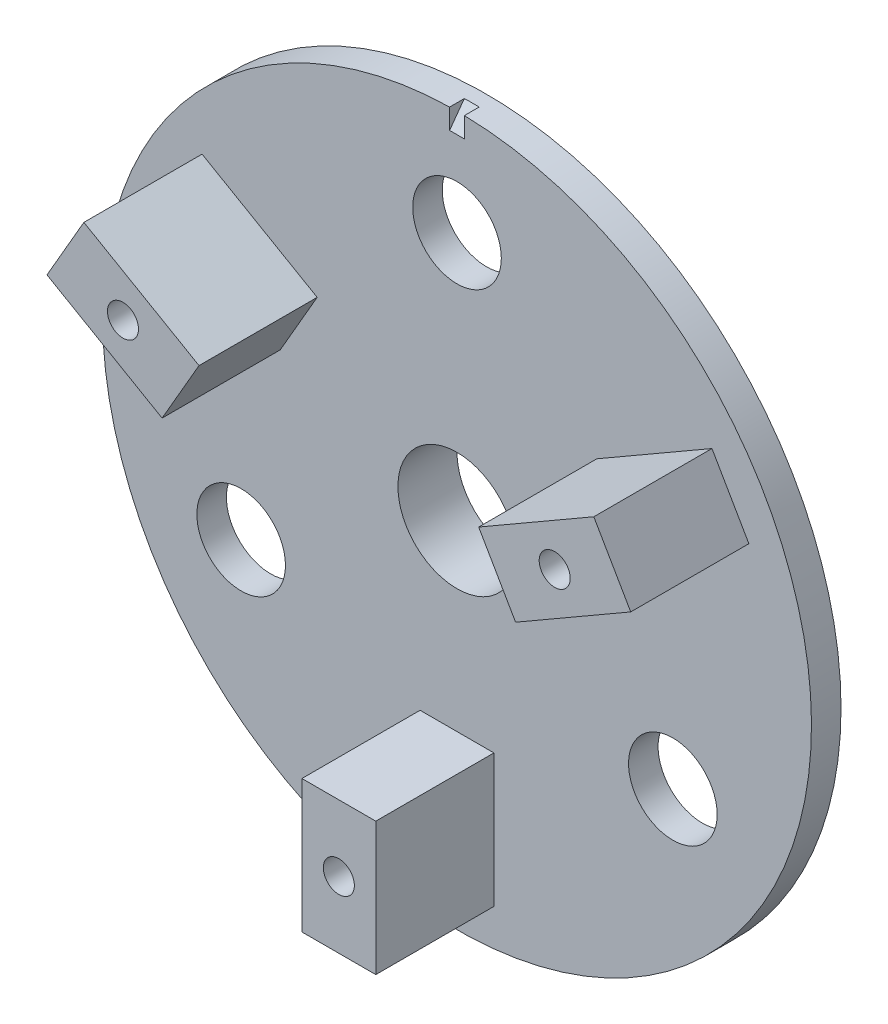
ISO-10303-21;
HEADER;
FILE_DESCRIPTION(('STEP AP214'),'2;1');
FILE_NAME('part.step','',(''),(''),'','','');
FILE_SCHEMA(('AUTOMOTIVE_DESIGN { 1 0 10303 214 1 1 1 1 }'));
ENDSEC;
DATA;
#1=APPLICATION_CONTEXT('core data for automotive mechanical design processes');
#2=APPLICATION_PROTOCOL_DEFINITION('international standard','automotive_design',2000,#1);
#3=PRODUCT_CONTEXT('',#1,'mechanical');
#4=PRODUCT('Part','Part','',(#3));
#5=PRODUCT_RELATED_PRODUCT_CATEGORY('part','',(#4));
#6=PRODUCT_DEFINITION_FORMATION('','',#4);
#7=PRODUCT_DEFINITION_CONTEXT('part definition',#1,'design');
#8=PRODUCT_DEFINITION('design','',#6,#7);
#9=PRODUCT_DEFINITION_SHAPE('','',#8);
#10=(LENGTH_UNIT() NAMED_UNIT(*) SI_UNIT(.MILLI.,.METRE.));
#11=(NAMED_UNIT(*) PLANE_ANGLE_UNIT() SI_UNIT($,.RADIAN.));
#12=(NAMED_UNIT(*) SI_UNIT($,.STERADIAN.) SOLID_ANGLE_UNIT());
#13=UNCERTAINTY_MEASURE_WITH_UNIT(LENGTH_MEASURE(1.E-05),#10,'distance_accuracy_value','');
#14=(GEOMETRIC_REPRESENTATION_CONTEXT(3) GLOBAL_UNCERTAINTY_ASSIGNED_CONTEXT((#13)) GLOBAL_UNIT_ASSIGNED_CONTEXT((#10,
#11,#12)) REPRESENTATION_CONTEXT('',''));
#15=CARTESIAN_POINT('',(0.,0.,0.));
#16=DIRECTION('',(0.,0.,1.));
#17=DIRECTION('',(1.,0.,0.));
#18=AXIS2_PLACEMENT_3D('',#15,#16,#17);
#19=CARTESIAN_POINT('',(0.,0.,2.));
#20=DIRECTION('',(0.,0.,1.));
#21=DIRECTION('',(1.,0.,0.));
#22=AXIS2_PLACEMENT_3D('',#19,#20,#21);
#23=PLANE('',#22);
#24=CARTESIAN_POINT('',(-29.2283573777247,-16.8750000000001,2.));
#25=DIRECTION('',(0.,0.,1.));
#26=DIRECTION('',(1.,0.,0.));
#27=AXIS2_PLACEMENT_3D('',#24,#25,#26);
#28=CIRCLE('',#27,6.);
#29=CARTESIAN_POINT('',(-23.2283573777247,-16.8750000000001,2.));
#30=VERTEX_POINT('',#29);
#31=EDGE_CURVE('E285',#30,#30,#28,.T.);
#32=ORIENTED_EDGE('',*,*,#31,.F.);
#33=EDGE_LOOP('',(#32));
#34=FACE_BOUND('',#33,.T.);
#35=CARTESIAN_POINT('',(29.228357377725,-16.8749999999997,2.));
#36=DIRECTION('',(0.,0.,1.));
#37=DIRECTION('',(1.,0.,0.));
#38=AXIS2_PLACEMENT_3D('',#35,#36,#37);
#39=CIRCLE('',#38,6.);
#40=CARTESIAN_POINT('',(35.228357377725,-16.8749999999997,2.));
#41=VERTEX_POINT('',#40);
#42=EDGE_CURVE('E278',#41,#41,#39,.T.);
#43=ORIENTED_EDGE('',*,*,#42,.F.);
#44=EDGE_LOOP('',(#43));
#45=FACE_BOUND('',#44,.T.);
#46=CARTESIAN_POINT('',(0.,33.75,2.000012));
#47=DIRECTION('',(0.,0.,1.));
#48=DIRECTION('',(1.,0.,0.));
#49=AXIS2_PLACEMENT_3D('',#46,#47,#48);
#50=CIRCLE('',#49,6.);
#51=CARTESIAN_POINT('',(6.00000000000001,33.75,2.000012));
#52=VERTEX_POINT('',#51);
#53=EDGE_CURVE('E287',#52,#52,#50,.T.);
#54=ORIENTED_EDGE('',*,*,#53,.F.);
#55=EDGE_LOOP('',(#54));
#56=FACE_BOUND('',#55,.T.);
#57=CARTESIAN_POINT('',(0.,0.,2.));
#58=DIRECTION('',(0.,0.,1.));
#59=DIRECTION('',(1.,0.,0.));
#60=AXIS2_PLACEMENT_3D('',#57,#58,#59);
#61=CIRCLE('',#60,8.);
#62=CARTESIAN_POINT('',(8.,0.,2.));
#63=VERTEX_POINT('',#62);
#64=EDGE_CURVE('E292',#63,#63,#61,.T.);
#65=ORIENTED_EDGE('',*,*,#64,.F.);
#66=EDGE_LOOP('',(#65));
#67=FACE_BOUND('',#66,.T.);
#68=CARTESIAN_POINT('',(0.,0.,2.));
#69=DIRECTION('',(0.,0.,1.));
#70=DIRECTION('',(1.,0.,0.));
#71=AXIS2_PLACEMENT_3D('',#68,#69,#70);
#72=CIRCLE('',#71,48.);
#73=CARTESIAN_POINT('',(-1.,47.9895822028073,2.));
#74=VERTEX_POINT('',#73);
#75=CARTESIAN_POINT('',(1.,47.9895822028073,2.));
#76=VERTEX_POINT('',#75);
#77=EDGE_CURVE('E336',#74,#76,#72,.T.);
#78=ORIENTED_EDGE('',*,*,#77,.T.);
#79=DIRECTION('',(0.,-1.,0.));
#80=VECTOR('',#79,1.);
#81=CARTESIAN_POINT('',(0.999999999999998,48.,2.));
#82=LINE('',#81,#80);
#83=CARTESIAN_POINT('',(1.,45.2477456734983,2.));
#84=VERTEX_POINT('',#83);
#85=EDGE_CURVE('E254',#76,#84,#82,.T.);
#86=ORIENTED_EDGE('',*,*,#85,.T.);
#87=DIRECTION('',(1.,0.,0.));
#88=VECTOR('',#87,1.);
#89=CARTESIAN_POINT('',(-1.,45.2477456734983,2.));
#90=LINE('',#89,#88);
#91=CARTESIAN_POINT('',(-1.,45.2477456734983,2.));
#92=VERTEX_POINT('',#91);
#93=EDGE_CURVE('E261',#92,#84,#90,.T.);
#94=ORIENTED_EDGE('',*,*,#93,.F.);
#95=DIRECTION('',(0.,-1.,0.));
#96=VECTOR('',#95,1.);
#97=CARTESIAN_POINT('',(-1.,48.,2.));
#98=LINE('',#97,#96);
#99=EDGE_CURVE('E251',#74,#92,#98,.T.);
#100=ORIENTED_EDGE('',*,*,#99,.F.);
#101=EDGE_LOOP('',(#78,#86,#94,#100));
#102=FACE_BOUND('',#101,.T.);
#103=DIRECTION('',(-1.,0.,0.));
#104=VECTOR('',#103,1.);
#105=CARTESIAN_POINT('',(0.,-42.75,2.));
#106=LINE('',#105,#104);
#107=CARTESIAN_POINT('',(5.,-42.75,2.));
#108=VERTEX_POINT('',#107);
#109=CARTESIAN_POINT('',(-5.,-42.75,2.));
#110=VERTEX_POINT('',#109);
#111=EDGE_CURVE('E356',#108,#110,#106,.T.);
#112=ORIENTED_EDGE('',*,*,#111,.T.);
#113=DIRECTION('',(0.,1.,0.));
#114=VECTOR('',#113,1.);
#115=CARTESIAN_POINT('',(-5.,0.,2.));
#116=LINE('',#115,#114);
#117=CARTESIAN_POINT('',(-5.,-24.75,2.));
#118=VERTEX_POINT('',#117);
#119=EDGE_CURVE('E365',#110,#118,#116,.T.);
#120=ORIENTED_EDGE('',*,*,#119,.T.);
#121=DIRECTION('',(1.,0.,0.));
#122=VECTOR('',#121,1.);
#123=CARTESIAN_POINT('',(0.,-24.75,2.));
#124=LINE('',#123,#122);
#125=CARTESIAN_POINT('',(5.,-24.75,2.));
#126=VERTEX_POINT('',#125);
#127=EDGE_CURVE('E347',#118,#126,#124,.T.);
#128=ORIENTED_EDGE('',*,*,#127,.T.);
#129=DIRECTION('',(0.,-1.,0.));
#130=VECTOR('',#129,1.);
#131=CARTESIAN_POINT('',(5.,0.,2.));
#132=LINE('',#131,#130);
#133=EDGE_CURVE('E353',#126,#108,#132,.T.);
#134=ORIENTED_EDGE('',*,*,#133,.T.);
#135=EDGE_LOOP('',(#112,#120,#128,#134));
#136=FACE_BOUND('',#135,.T.);
#137=DIRECTION('',(0.500000000000001,0.866025403784439,0.));
#138=VECTOR('',#137,1.);
#139=CARTESIAN_POINT('',(-37.0225860117848,21.375,2.));
#140=LINE('',#139,#138);
#141=CARTESIAN_POINT('',(-39.5225860117848,17.0448729810778,2.));
#142=VERTEX_POINT('',#141);
#143=CARTESIAN_POINT('',(-34.5225860117848,25.7051270189222,2.));
#144=VERTEX_POINT('',#143);
#145=EDGE_CURVE('E372',#142,#144,#140,.T.);
#146=ORIENTED_EDGE('',*,*,#145,.T.);
#147=DIRECTION('',(0.866025403784439,-0.500000000000001,0.));
#148=VECTOR('',#147,1.);
#149=CARTESIAN_POINT('',(2.5,4.33012701892219,2.));
#150=LINE('',#149,#148);
#151=CARTESIAN_POINT('',(-18.9341287436649,16.7051270189222,2.));
#152=VERTEX_POINT('',#151);
#153=EDGE_CURVE('E377',#144,#152,#150,.T.);
#154=ORIENTED_EDGE('',*,*,#153,.T.);
#155=DIRECTION('',(-0.500000000000001,-0.866025403784439,0.));
#156=VECTOR('',#155,1.);
#157=CARTESIAN_POINT('',(-21.4341287436649,12.375,2.));
#158=LINE('',#157,#156);
#159=CARTESIAN_POINT('',(-23.9341287436649,8.04487298107782,2.));
#160=VERTEX_POINT('',#159);
#161=EDGE_CURVE('E366',#152,#160,#158,.T.);
#162=ORIENTED_EDGE('',*,*,#161,.T.);
#163=DIRECTION('',(-0.866025403784439,0.500000000000001,0.));
#164=VECTOR('',#163,1.);
#165=CARTESIAN_POINT('',(-2.5,-4.3301270189222,2.));
#166=LINE('',#165,#164);
#167=EDGE_CURVE('E369',#160,#142,#166,.T.);
#168=ORIENTED_EDGE('',*,*,#167,.T.);
#169=EDGE_LOOP('',(#146,#154,#162,#168));
#170=FACE_BOUND('',#169,.T.);
#171=DIRECTION('',(0.5,-0.866025403784439,0.));
#172=VECTOR('',#171,1.);
#173=CARTESIAN_POINT('',(37.0225860117848,21.375,2.));
#174=LINE('',#173,#172);
#175=CARTESIAN_POINT('',(34.5225860117848,25.7051270189222,2.));
#176=VERTEX_POINT('',#175);
#177=CARTESIAN_POINT('',(39.5225860117848,17.0448729810778,2.));
#178=VERTEX_POINT('',#177);
#179=EDGE_CURVE('E49',#176,#178,#174,.T.);
#180=ORIENTED_EDGE('',*,*,#179,.T.);
#181=DIRECTION('',(-0.866025403784439,-0.5,0.));
#182=VECTOR('',#181,1.);
#183=CARTESIAN_POINT('',(2.5,-4.33012701892219,2.));
#184=LINE('',#183,#182);
#185=CARTESIAN_POINT('',(23.9341287436649,8.0448729810778,2.));
#186=VERTEX_POINT('',#185);
#187=EDGE_CURVE('E11',#178,#186,#184,.T.);
#188=ORIENTED_EDGE('',*,*,#187,.T.);
#189=DIRECTION('',(-0.5,0.866025403784439,0.));
#190=VECTOR('',#189,1.);
#191=CARTESIAN_POINT('',(21.4341287436649,12.375,2.));
#192=LINE('',#191,#190);
#193=CARTESIAN_POINT('',(18.9341287436649,16.7051270189222,2.));
#194=VERTEX_POINT('',#193);
#195=EDGE_CURVE('E385',#186,#194,#192,.T.);
#196=ORIENTED_EDGE('',*,*,#195,.T.);
#197=DIRECTION('',(0.866025403784439,0.5,0.));
#198=VECTOR('',#197,1.);
#199=CARTESIAN_POINT('',(-2.5,4.33012701892219,2.));
#200=LINE('',#199,#198);
#201=EDGE_CURVE('E388',#194,#176,#200,.T.);
#202=ORIENTED_EDGE('',*,*,#201,.T.);
#203=EDGE_LOOP('',(#180,#188,#196,#202));
#204=FACE_BOUND('',#203,.T.);
#205=ADVANCED_FACE('F41',(#34,#45,#56,#67,#102,#136,#170,#204),#23,.T.);
#206=CARTESIAN_POINT('',(0.,0.,-2.));
#207=DIRECTION('',(0.,0.,1.));
#208=DIRECTION('',(1.,0.,0.));
#209=AXIS2_PLACEMENT_3D('',#206,#207,#208);
#210=PLANE('',#209);
#211=CARTESIAN_POINT('',(0.,0.,-2.));
#212=DIRECTION('',(0.,0.,1.));
#213=DIRECTION('',(1.,0.,0.));
#214=AXIS2_PLACEMENT_3D('',#211,#212,#213);
#215=CIRCLE('',#214,13.);
#216=CARTESIAN_POINT('',(13.,0.,-2.));
#217=VERTEX_POINT('',#216);
#218=EDGE_CURVE('E349',#217,#217,#215,.F.);
#219=ORIENTED_EDGE('',*,*,#218,.F.);
#220=EDGE_LOOP('',(#219));
#221=FACE_BOUND('',#220,.T.);
#222=CARTESIAN_POINT('',(-29.2283573777247,-16.8750000000001,-2.));
#223=DIRECTION('',(0.,0.,1.));
#224=DIRECTION('',(-0.500000000000004,0.866025403784437,0.));
#225=AXIS2_PLACEMENT_3D('',#222,#223,#224);
#226=CIRCLE('',#225,6.);
#227=CARTESIAN_POINT('',(-32.2283573777248,-11.6788475772935,-2.));
#228=VERTEX_POINT('',#227);
#229=EDGE_CURVE('E275',#228,#228,#226,.T.);
#230=ORIENTED_EDGE('',*,*,#229,.T.);
#231=EDGE_LOOP('',(#230));
#232=FACE_BOUND('',#231,.T.);
#233=CARTESIAN_POINT('',(29.228357377725,-16.8749999999997,-2.));
#234=DIRECTION('',(0.,0.,1.));
#235=DIRECTION('',(-0.499999999999992,-0.866025403784443,0.));
#236=AXIS2_PLACEMENT_3D('',#233,#234,#235);
#237=CIRCLE('',#236,6.);
#238=CARTESIAN_POINT('',(26.228357377725,-22.0711524227064,-2.));
#239=VERTEX_POINT('',#238);
#240=EDGE_CURVE('E272',#239,#239,#237,.T.);
#241=ORIENTED_EDGE('',*,*,#240,.T.);
#242=EDGE_LOOP('',(#241));
#243=FACE_BOUND('',#242,.T.);
#244=CARTESIAN_POINT('',(0.,33.75,-2.));
#245=DIRECTION('',(0.,0.,1.));
#246=DIRECTION('',(1.,0.,0.));
#247=AXIS2_PLACEMENT_3D('',#244,#245,#246);
#248=CIRCLE('',#247,6.);
#249=CARTESIAN_POINT('',(6.00000000000001,33.75,-2.));
#250=VERTEX_POINT('',#249);
#251=EDGE_CURVE('E289',#250,#250,#248,.T.);
#252=ORIENTED_EDGE('',*,*,#251,.T.);
#253=EDGE_LOOP('',(#252));
#254=FACE_BOUND('',#253,.T.);
#255=CARTESIAN_POINT('',(0.,0.,-2.));
#256=DIRECTION('',(0.,0.,1.));
#257=DIRECTION('',(1.,0.,0.));
#258=AXIS2_PLACEMENT_3D('',#255,#256,#257);
#259=CIRCLE('',#258,48.);
#260=CARTESIAN_POINT('',(48.,0.,-2.));
#261=VERTEX_POINT('',#260);
#262=EDGE_CURVE('E515',#261,#261,#259,.T.);
#263=ORIENTED_EDGE('',*,*,#262,.F.);
#264=EDGE_LOOP('',(#263));
#265=FACE_BOUND('',#264,.T.);
#266=ADVANCED_FACE('F323',(#221,#232,#243,#254,#265),#210,.F.);
#267=CARTESIAN_POINT('',(0.,0.,2.));
#268=DIRECTION('',(0.,0.,-1.));
#269=DIRECTION('',(-1.,0.,0.));
#270=AXIS2_PLACEMENT_3D('',#267,#268,#269);
#271=CYLINDRICAL_SURFACE('',#270,48.);
#272=DIRECTION('',(0.,0.,-1.));
#273=VECTOR('',#272,1.);
#274=CARTESIAN_POINT('',(-1.,47.9895822028073,2.));
#275=LINE('',#274,#273);
#276=CARTESIAN_POINT('',(-1.,47.9895822028073,0.00757037392393536));
#277=VERTEX_POINT('',#276);
#278=EDGE_CURVE('E344',#74,#277,#275,.T.);
#279=ORIENTED_EDGE('',*,*,#278,.T.);
#280=CARTESIAN_POINT('',(0.,0.,34.8804974437164));
#281=DIRECTION('',(0.,-0.587856465450031,-0.808965250198423));
#282=DIRECTION('',(0.,0.808965250198423,-0.587856465450031));
#283=AXIS2_PLACEMENT_3D('',#280,#281,#282);
#284=ELLIPSE('',#283,59.3350579499262,48.);
#285=CARTESIAN_POINT('',(1.,47.9895822028073,0.00757037392393536));
#286=VERTEX_POINT('',#285);
#287=EDGE_CURVE('E340',#277,#286,#284,.T.);
#288=ORIENTED_EDGE('',*,*,#287,.T.);
#289=DIRECTION('',(0.,0.,-1.));
#290=VECTOR('',#289,1.);
#291=CARTESIAN_POINT('',(1.,47.9895822028073,2.));
#292=LINE('',#291,#290);
#293=EDGE_CURVE('E328',#76,#286,#292,.T.);
#294=ORIENTED_EDGE('',*,*,#293,.F.);
#295=ORIENTED_EDGE('',*,*,#77,.F.);
#296=EDGE_LOOP('',(#279,#288,#294,#295));
#297=FACE_BOUND('',#296,.T.);
#298=ORIENTED_EDGE('',*,*,#262,.T.);
#299=EDGE_LOOP('',(#298));
#300=FACE_BOUND('',#299,.T.);
#301=ADVANCED_FACE('F43',(#297,#300),#271,.T.);
#302=CARTESIAN_POINT('',(0.,0.,2.));
#303=DIRECTION('',(0.,0.,-1.));
#304=DIRECTION('',(-1.,0.,0.));
#305=AXIS2_PLACEMENT_3D('',#302,#303,#304);
#306=CYLINDRICAL_SURFACE('',#305,8.);
#307=ORIENTED_EDGE('',*,*,#64,.T.);
#308=EDGE_LOOP('',(#307));
#309=FACE_BOUND('',#308,.T.);
#310=CARTESIAN_POINT('',(0.,0.,-6.));
#311=DIRECTION('',(0.,0.,1.));
#312=DIRECTION('',(1.,0.,0.));
#313=AXIS2_PLACEMENT_3D('',#310,#311,#312);
#314=CIRCLE('',#313,8.);
#315=CARTESIAN_POINT('',(8.,0.,-6.));
#316=VERTEX_POINT('',#315);
#317=EDGE_CURVE('E244',#316,#316,#314,.T.);
#318=ORIENTED_EDGE('',*,*,#317,.F.);
#319=EDGE_LOOP('',(#318));
#320=FACE_BOUND('',#319,.T.);
#321=ADVANCED_FACE('F312',(#309,#320),#306,.F.);
#322=CARTESIAN_POINT('',(0.,33.75,-2.));
#323=DIRECTION('',(0.,0.,1.));
#324=DIRECTION('',(1.,0.,0.));
#325=AXIS2_PLACEMENT_3D('',#322,#323,#324);
#326=CYLINDRICAL_SURFACE('',#325,6.);
#327=ORIENTED_EDGE('',*,*,#251,.F.);
#328=EDGE_LOOP('',(#327));
#329=FACE_BOUND('',#328,.T.);
#330=ORIENTED_EDGE('',*,*,#53,.T.);
#331=EDGE_LOOP('',(#330));
#332=FACE_BOUND('',#331,.T.);
#333=ADVANCED_FACE('F305',(#329,#332),#326,.F.);
#334=CARTESIAN_POINT('',(29.228357377725,-16.8749999999997,-2.));
#335=DIRECTION('',(0.,0.,1.));
#336=DIRECTION('',(1.,0.,0.));
#337=AXIS2_PLACEMENT_3D('',#334,#335,#336);
#338=CYLINDRICAL_SURFACE('',#337,6.);
#339=ORIENTED_EDGE('',*,*,#42,.T.);
#340=EDGE_LOOP('',(#339));
#341=FACE_BOUND('',#340,.T.);
#342=ORIENTED_EDGE('',*,*,#240,.F.);
#343=EDGE_LOOP('',(#342));
#344=FACE_BOUND('',#343,.T.);
#345=ADVANCED_FACE('F315',(#341,#344),#338,.F.);
#346=CARTESIAN_POINT('',(-29.2283573777247,-16.8750000000001,-2.));
#347=DIRECTION('',(0.,0.,1.));
#348=DIRECTION('',(1.,0.,0.));
#349=AXIS2_PLACEMENT_3D('',#346,#347,#348);
#350=CYLINDRICAL_SURFACE('',#349,6.);
#351=ORIENTED_EDGE('',*,*,#31,.T.);
#352=EDGE_LOOP('',(#351));
#353=FACE_BOUND('',#352,.T.);
#354=ORIENTED_EDGE('',*,*,#229,.F.);
#355=EDGE_LOOP('',(#354));
#356=FACE_BOUND('',#355,.T.);
#357=ADVANCED_FACE('F489',(#353,#356),#350,.F.);
#358=CARTESIAN_POINT('',(-1.,45.2477456734983,2.));
#359=DIRECTION('',(0.,-0.587856465450031,-0.808965250198423));
#360=DIRECTION('',(0.,0.808965250198423,-0.587856465450031));
#361=AXIS2_PLACEMENT_3D('',#358,#359,#360);
#362=PLANE('',#361);
#363=ORIENTED_EDGE('',*,*,#287,.F.);
#364=DIRECTION('',(0.,0.808965250198423,-0.587856465450031));
#365=VECTOR('',#364,1.);
#366=CARTESIAN_POINT('',(-1.,45.2477456734983,2.));
#367=LINE('',#366,#365);
#368=EDGE_CURVE('E259',#92,#277,#367,.T.);
#369=ORIENTED_EDGE('',*,*,#368,.F.);
#370=ORIENTED_EDGE('',*,*,#93,.T.);
#371=DIRECTION('',(0.,0.808965250198423,-0.587856465450031));
#372=VECTOR('',#371,1.);
#373=CARTESIAN_POINT('',(1.,45.2477456734983,2.));
#374=LINE('',#373,#372);
#375=EDGE_CURVE('E257',#84,#286,#374,.T.);
#376=ORIENTED_EDGE('',*,*,#375,.T.);
#377=EDGE_LOOP('',(#363,#369,#370,#376));
#378=FACE_BOUND('',#377,.T.);
#379=ADVANCED_FACE('F483',(#378),#362,.F.);
#380=CARTESIAN_POINT('',(-1.,0.,0.));
#381=DIRECTION('',(-1.,0.,0.));
#382=DIRECTION('',(0.,0.,1.));
#383=AXIS2_PLACEMENT_3D('',#380,#381,#382);
#384=PLANE('',#383);
#385=ORIENTED_EDGE('',*,*,#99,.T.);
#386=ORIENTED_EDGE('',*,*,#368,.T.);
#387=ORIENTED_EDGE('',*,*,#278,.F.);
#388=EDGE_LOOP('',(#385,#386,#387));
#389=FACE_BOUND('',#388,.T.);
#390=ADVANCED_FACE('F481',(#389),#384,.F.);
#391=CARTESIAN_POINT('',(1.,0.,0.));
#392=DIRECTION('',(-1.,0.,0.));
#393=DIRECTION('',(0.,0.,1.));
#394=AXIS2_PLACEMENT_3D('',#391,#392,#393);
#395=PLANE('',#394);
#396=ORIENTED_EDGE('',*,*,#293,.T.);
#397=ORIENTED_EDGE('',*,*,#375,.F.);
#398=ORIENTED_EDGE('',*,*,#85,.F.);
#399=EDGE_LOOP('',(#396,#397,#398));
#400=FACE_BOUND('',#399,.T.);
#401=ADVANCED_FACE('F478',(#400),#395,.T.);
#402=CARTESIAN_POINT('',(0.,0.,0.));
#403=DIRECTION('',(0.,0.,1.));
#404=DIRECTION('',(1.,0.,0.));
#405=AXIS2_PLACEMENT_3D('',#402,#403,#404);
#406=CYLINDRICAL_SURFACE('',#405,13.);
#407=CARTESIAN_POINT('',(0.,0.,-6.));
#408=DIRECTION('',(0.,0.,1.));
#409=DIRECTION('',(1.,0.,0.));
#410=AXIS2_PLACEMENT_3D('',#407,#408,#409);
#411=CIRCLE('',#410,13.);
#412=CARTESIAN_POINT('',(13.,0.,-6.));
#413=VERTEX_POINT('',#412);
#414=EDGE_CURVE('E248',#413,#413,#411,.T.);
#415=ORIENTED_EDGE('',*,*,#414,.T.);
#416=EDGE_LOOP('',(#415));
#417=FACE_BOUND('',#416,.T.);
#418=ORIENTED_EDGE('',*,*,#218,.T.);
#419=EDGE_LOOP('',(#418));
#420=FACE_BOUND('',#419,.T.);
#421=ADVANCED_FACE('F471',(#417,#420),#406,.T.);
#422=CARTESIAN_POINT('',(0.,13.,-6.));
#423=DIRECTION('',(0.,0.,1.));
#424=DIRECTION('',(1.,0.,0.));
#425=AXIS2_PLACEMENT_3D('',#422,#423,#424);
#426=PLANE('',#425);
#427=ORIENTED_EDGE('',*,*,#414,.F.);
#428=EDGE_LOOP('',(#427));
#429=FACE_BOUND('',#428,.T.);
#430=ORIENTED_EDGE('',*,*,#317,.T.);
#431=EDGE_LOOP('',(#430));
#432=FACE_BOUND('',#431,.T.);
#433=ADVANCED_FACE('F473',(#429,#432),#426,.F.);
#434=CARTESIAN_POINT('',(-5.,-42.75,18.));
#435=DIRECTION('',(1.,0.,0.));
#436=DIRECTION('',(0.,0.,-1.));
#437=AXIS2_PLACEMENT_3D('',#434,#435,#436);
#438=PLANE('',#437);
#439=ORIENTED_EDGE('',*,*,#119,.F.);
#440=DIRECTION('',(0.,0.,-1.));
#441=VECTOR('',#440,1.);
#442=CARTESIAN_POINT('',(-5.,-42.75,18.));
#443=LINE('',#442,#441);
#444=CARTESIAN_POINT('',(-5.,-42.75,18.));
#445=VERTEX_POINT('',#444);
#446=EDGE_CURVE('E241',#445,#110,#443,.T.);
#447=ORIENTED_EDGE('',*,*,#446,.F.);
#448=DIRECTION('',(0.,-1.,0.));
#449=VECTOR('',#448,1.);
#450=CARTESIAN_POINT('',(-5.,-42.75,18.));
#451=LINE('',#450,#449);
#452=CARTESIAN_POINT('',(-5.,-24.75,18.));
#453=VERTEX_POINT('',#452);
#454=EDGE_CURVE('E219',#453,#445,#451,.T.);
#455=ORIENTED_EDGE('',*,*,#454,.F.);
#456=DIRECTION('',(0.,0.,-1.));
#457=VECTOR('',#456,1.);
#458=CARTESIAN_POINT('',(-5.,-24.75,18.));
#459=LINE('',#458,#457);
#460=EDGE_CURVE('E229',#453,#118,#459,.T.);
#461=ORIENTED_EDGE('',*,*,#460,.T.);
#462=EDGE_LOOP('',(#439,#447,#455,#461));
#463=FACE_BOUND('',#462,.T.);
#464=ADVANCED_FACE('F470',(#463),#438,.F.);
#465=CARTESIAN_POINT('',(5.,-42.75,18.));
#466=DIRECTION('',(0.,1.,0.));
#467=DIRECTION('',(0.,0.,1.));
#468=AXIS2_PLACEMENT_3D('',#465,#466,#467);
#469=PLANE('',#468);
#470=ORIENTED_EDGE('',*,*,#111,.F.);
#471=DIRECTION('',(0.,0.,-1.));
#472=VECTOR('',#471,1.);
#473=CARTESIAN_POINT('',(5.,-42.75,18.));
#474=LINE('',#473,#472);
#475=CARTESIAN_POINT('',(5.,-42.75,18.));
#476=VERTEX_POINT('',#475);
#477=EDGE_CURVE('E240',#476,#108,#474,.T.);
#478=ORIENTED_EDGE('',*,*,#477,.F.);
#479=DIRECTION('',(1.,0.,0.));
#480=VECTOR('',#479,1.);
#481=CARTESIAN_POINT('',(5.,-42.75,18.));
#482=LINE('',#481,#480);
#483=EDGE_CURVE('E221',#445,#476,#482,.T.);
#484=ORIENTED_EDGE('',*,*,#483,.F.);
#485=ORIENTED_EDGE('',*,*,#446,.T.);
#486=EDGE_LOOP('',(#470,#478,#484,#485));
#487=FACE_BOUND('',#486,.T.);
#488=ADVANCED_FACE('F464',(#487),#469,.F.);
#489=CARTESIAN_POINT('',(5.,-24.75,18.));
#490=DIRECTION('',(-1.,0.,0.));
#491=DIRECTION('',(0.,0.,1.));
#492=AXIS2_PLACEMENT_3D('',#489,#490,#491);
#493=PLANE('',#492);
#494=ORIENTED_EDGE('',*,*,#133,.F.);
#495=DIRECTION('',(0.,0.,-1.));
#496=VECTOR('',#495,1.);
#497=CARTESIAN_POINT('',(5.,-24.75,18.));
#498=LINE('',#497,#496);
#499=CARTESIAN_POINT('',(5.,-24.75,18.));
#500=VERTEX_POINT('',#499);
#501=EDGE_CURVE('E234',#500,#126,#498,.T.);
#502=ORIENTED_EDGE('',*,*,#501,.F.);
#503=DIRECTION('',(0.,1.,0.));
#504=VECTOR('',#503,1.);
#505=CARTESIAN_POINT('',(5.,-24.75,18.));
#506=LINE('',#505,#504);
#507=EDGE_CURVE('E223',#476,#500,#506,.T.);
#508=ORIENTED_EDGE('',*,*,#507,.F.);
#509=ORIENTED_EDGE('',*,*,#477,.T.);
#510=EDGE_LOOP('',(#494,#502,#508,#509));
#511=FACE_BOUND('',#510,.T.);
#512=ADVANCED_FACE('F458',(#511),#493,.F.);
#513=CARTESIAN_POINT('',(-5.,-24.75,18.));
#514=DIRECTION('',(0.,-1.,0.));
#515=DIRECTION('',(0.,0.,-1.));
#516=AXIS2_PLACEMENT_3D('',#513,#514,#515);
#517=PLANE('',#516);
#518=ORIENTED_EDGE('',*,*,#127,.F.);
#519=ORIENTED_EDGE('',*,*,#460,.F.);
#520=DIRECTION('',(-1.,0.,0.));
#521=VECTOR('',#520,1.);
#522=CARTESIAN_POINT('',(-5.,-24.75,18.));
#523=LINE('',#522,#521);
#524=EDGE_CURVE('E227',#500,#453,#523,.T.);
#525=ORIENTED_EDGE('',*,*,#524,.F.);
#526=ORIENTED_EDGE('',*,*,#501,.T.);
#527=EDGE_LOOP('',(#518,#519,#525,#526));
#528=FACE_BOUND('',#527,.T.);
#529=ADVANCED_FACE('F451',(#528),#517,.F.);
#530=CARTESIAN_POINT('',(0.,0.,18.));
#531=DIRECTION('',(0.,0.,-1.));
#532=DIRECTION('',(-1.,0.,0.));
#533=AXIS2_PLACEMENT_3D('',#530,#531,#532);
#534=PLANE('',#533);
#535=CARTESIAN_POINT('',(0.,-33.75,18.));
#536=DIRECTION('',(0.,0.,1.));
#537=DIRECTION('',(1.,0.,0.));
#538=AXIS2_PLACEMENT_3D('',#535,#536,#537);
#539=CIRCLE('',#538,2.1);
#540=CARTESIAN_POINT('',(2.1,-33.75,18.));
#541=VERTEX_POINT('',#540);
#542=EDGE_CURVE('E176',#541,#541,#539,.T.);
#543=ORIENTED_EDGE('',*,*,#542,.F.);
#544=EDGE_LOOP('',(#543));
#545=FACE_BOUND('',#544,.T.);
#546=ORIENTED_EDGE('',*,*,#454,.T.);
#547=ORIENTED_EDGE('',*,*,#483,.T.);
#548=ORIENTED_EDGE('',*,*,#507,.T.);
#549=ORIENTED_EDGE('',*,*,#524,.T.);
#550=EDGE_LOOP('',(#546,#547,#548,#549));
#551=FACE_BOUND('',#550,.T.);
#552=ADVANCED_FACE('F453',(#545,#551),#534,.F.);
#553=CARTESIAN_POINT('',(0.,-33.75,6.));
#554=DIRECTION('',(0.,0.,1.));
#555=DIRECTION('',(1.,0.,0.));
#556=AXIS2_PLACEMENT_3D('',#553,#554,#555);
#557=CYLINDRICAL_SURFACE('',#556,2.1);
#558=CARTESIAN_POINT('',(0.,-33.75,6.));
#559=DIRECTION('',(0.,0.,1.));
#560=DIRECTION('',(1.,0.,0.));
#561=AXIS2_PLACEMENT_3D('',#558,#559,#560);
#562=CIRCLE('',#561,2.1);
#563=CARTESIAN_POINT('',(2.1,-33.75,6.));
#564=VERTEX_POINT('',#563);
#565=EDGE_CURVE('E185',#564,#564,#562,.T.);
#566=ORIENTED_EDGE('',*,*,#565,.F.);
#567=EDGE_LOOP('',(#566));
#568=FACE_BOUND('',#567,.T.);
#569=ORIENTED_EDGE('',*,*,#542,.T.);
#570=EDGE_LOOP('',(#569));
#571=FACE_BOUND('',#570,.T.);
#572=ADVANCED_FACE('F450',(#568,#571),#557,.F.);
#573=CARTESIAN_POINT('',(0.,-33.75,6.));
#574=DIRECTION('',(0.,0.,1.));
#575=DIRECTION('',(1.,0.,0.));
#576=AXIS2_PLACEMENT_3D('',#573,#574,#575);
#577=PLANE('',#576);
#578=ORIENTED_EDGE('',*,*,#565,.T.);
#579=EDGE_LOOP('',(#578));
#580=FACE_BOUND('',#579,.T.);
#581=ADVANCED_FACE('F442',(#580),#577,.T.);
#582=CARTESIAN_POINT('',(-34.5225860117848,25.7051270189222,18.));
#583=DIRECTION('',(-0.500000000000001,-0.866025403784438,0.));
#584=DIRECTION('',(0.866025403784439,-0.500000000000001,0.));
#585=AXIS2_PLACEMENT_3D('',#582,#583,#584);
#586=PLANE('',#585);
#587=ORIENTED_EDGE('',*,*,#153,.F.);
#588=DIRECTION('',(0.,0.,-1.));
#589=VECTOR('',#588,1.);
#590=CARTESIAN_POINT('',(-34.5225860117848,25.7051270189222,18.));
#591=LINE('',#590,#589);
#592=CARTESIAN_POINT('',(-34.5225860117848,25.7051270189222,18.));
#593=VERTEX_POINT('',#592);
#594=EDGE_CURVE('E175',#593,#144,#591,.T.);
#595=ORIENTED_EDGE('',*,*,#594,.F.);
#596=DIRECTION('',(-0.866025403784439,0.5,0.));
#597=VECTOR('',#596,1.);
#598=CARTESIAN_POINT('',(-34.5225860117848,25.7051270189222,18.));
#599=LINE('',#598,#597);
#600=CARTESIAN_POINT('',(-18.9341287436649,16.7051270189222,18.));
#601=VERTEX_POINT('',#600);
#602=EDGE_CURVE('E190',#601,#593,#599,.T.);
#603=ORIENTED_EDGE('',*,*,#602,.F.);
#604=DIRECTION('',(0.,0.,-1.));
#605=VECTOR('',#604,1.);
#606=CARTESIAN_POINT('',(-18.9341287436649,16.7051270189222,18.));
#607=LINE('',#606,#605);
#608=EDGE_CURVE('E201',#601,#152,#607,.T.);
#609=ORIENTED_EDGE('',*,*,#608,.T.);
#610=EDGE_LOOP('',(#587,#595,#603,#609));
#611=FACE_BOUND('',#610,.T.);
#612=ADVANCED_FACE('F437',(#611),#586,.F.);
#613=CARTESIAN_POINT('',(-39.5225860117848,17.0448729810778,18.));
#614=DIRECTION('',(0.866025403784438,-0.500000000000001,0.));
#615=DIRECTION('',(0.500000000000001,0.866025403784439,0.));
#616=AXIS2_PLACEMENT_3D('',#613,#614,#615);
#617=PLANE('',#616);
#618=ORIENTED_EDGE('',*,*,#145,.F.);
#619=DIRECTION('',(0.,0.,-1.));
#620=VECTOR('',#619,1.);
#621=CARTESIAN_POINT('',(-39.5225860117848,17.0448729810778,18.));
#622=LINE('',#621,#620);
#623=CARTESIAN_POINT('',(-39.5225860117848,17.0448729810778,18.));
#624=VERTEX_POINT('',#623);
#625=EDGE_CURVE('E210',#624,#142,#622,.T.);
#626=ORIENTED_EDGE('',*,*,#625,.F.);
#627=DIRECTION('',(-0.5,-0.866025403784439,0.));
#628=VECTOR('',#627,1.);
#629=CARTESIAN_POINT('',(-39.5225860117848,17.0448729810778,18.));
#630=LINE('',#629,#628);
#631=EDGE_CURVE('E193',#593,#624,#630,.T.);
#632=ORIENTED_EDGE('',*,*,#631,.F.);
#633=ORIENTED_EDGE('',*,*,#594,.T.);
#634=EDGE_LOOP('',(#618,#626,#632,#633));
#635=FACE_BOUND('',#634,.T.);
#636=ADVANCED_FACE('F434',(#635),#617,.F.);
#637=CARTESIAN_POINT('',(-23.9341287436649,8.04487298107782,18.));
#638=DIRECTION('',(0.500000000000001,0.866025403784438,0.));
#639=DIRECTION('',(-0.866025403784439,0.500000000000001,0.));
#640=AXIS2_PLACEMENT_3D('',#637,#638,#639);
#641=PLANE('',#640);
#642=ORIENTED_EDGE('',*,*,#167,.F.);
#643=DIRECTION('',(0.,0.,-1.));
#644=VECTOR('',#643,1.);
#645=CARTESIAN_POINT('',(-23.9341287436649,8.04487298107782,18.));
#646=LINE('',#645,#644);
#647=CARTESIAN_POINT('',(-23.9341287436649,8.04487298107782,18.));
#648=VERTEX_POINT('',#647);
#649=EDGE_CURVE('E61',#648,#160,#646,.T.);
#650=ORIENTED_EDGE('',*,*,#649,.F.);
#651=DIRECTION('',(0.866025403784439,-0.5,0.));
#652=VECTOR('',#651,1.);
#653=CARTESIAN_POINT('',(-23.9341287436649,8.04487298107782,18.));
#654=LINE('',#653,#652);
#655=EDGE_CURVE('E191',#624,#648,#654,.T.);
#656=ORIENTED_EDGE('',*,*,#655,.F.);
#657=ORIENTED_EDGE('',*,*,#625,.T.);
#658=EDGE_LOOP('',(#642,#650,#656,#657));
#659=FACE_BOUND('',#658,.T.);
#660=ADVANCED_FACE('F435',(#659),#641,.F.);
#661=CARTESIAN_POINT('',(-18.9341287436649,16.7051270189222,18.));
#662=DIRECTION('',(-0.866025403784438,0.500000000000001,0.));
#663=DIRECTION('',(-0.500000000000001,-0.866025403784439,0.));
#664=AXIS2_PLACEMENT_3D('',#661,#662,#663);
#665=PLANE('',#664);
#666=ORIENTED_EDGE('',*,*,#161,.F.);
#667=ORIENTED_EDGE('',*,*,#608,.F.);
#668=DIRECTION('',(0.5,0.866025403784439,0.));
#669=VECTOR('',#668,1.);
#670=CARTESIAN_POINT('',(-18.9341287436649,16.7051270189222,18.));
#671=LINE('',#670,#669);
#672=EDGE_CURVE('E200',#648,#601,#671,.T.);
#673=ORIENTED_EDGE('',*,*,#672,.F.);
#674=ORIENTED_EDGE('',*,*,#649,.T.);
#675=EDGE_LOOP('',(#666,#667,#673,#674));
#676=FACE_BOUND('',#675,.T.);
#677=ADVANCED_FACE('F426',(#676),#665,.F.);
#678=CARTESIAN_POINT('',(0.,0.,18.));
#679=DIRECTION('',(0.,0.,-1.));
#680=DIRECTION('',(0.5,0.866025403784439,0.));
#681=AXIS2_PLACEMENT_3D('',#678,#679,#680);
#682=PLANE('',#681);
#683=CARTESIAN_POINT('',(-29.2283573777248,16.875,18.));
#684=DIRECTION('',(0.,0.,1.));
#685=DIRECTION('',(-0.5,-0.866025403784439,0.));
#686=AXIS2_PLACEMENT_3D('',#683,#684,#685);
#687=CIRCLE('',#686,2.1);
#688=CARTESIAN_POINT('',(-30.2783573777248,15.0563466520527,18.));
#689=VERTEX_POINT('',#688);
#690=EDGE_CURVE('E700',#689,#689,#687,.T.);
#691=ORIENTED_EDGE('',*,*,#690,.F.);
#692=EDGE_LOOP('',(#691));
#693=FACE_BOUND('',#692,.T.);
#694=ORIENTED_EDGE('',*,*,#602,.T.);
#695=ORIENTED_EDGE('',*,*,#631,.T.);
#696=ORIENTED_EDGE('',*,*,#655,.T.);
#697=ORIENTED_EDGE('',*,*,#672,.T.);
#698=EDGE_LOOP('',(#694,#695,#696,#697));
#699=FACE_BOUND('',#698,.T.);
#700=ADVANCED_FACE('F424',(#693,#699),#682,.F.);
#701=CARTESIAN_POINT('',(39.5225860117848,17.0448729810778,18.));
#702=DIRECTION('',(-0.5,0.866025403784439,0.));
#703=DIRECTION('',(-0.866025403784439,-0.5,0.));
#704=AXIS2_PLACEMENT_3D('',#701,#702,#703);
#705=PLANE('',#704);
#706=ORIENTED_EDGE('',*,*,#187,.F.);
#707=DIRECTION('',(0.,0.,-1.));
#708=VECTOR('',#707,1.);
#709=CARTESIAN_POINT('',(39.5225860117848,17.0448729810778,18.));
#710=LINE('',#709,#708);
#711=CARTESIAN_POINT('',(39.5225860117848,17.0448729810778,18.));
#712=VERTEX_POINT('',#711);
#713=EDGE_CURVE('E152',#712,#178,#710,.T.);
#714=ORIENTED_EDGE('',*,*,#713,.F.);
#715=DIRECTION('',(0.866025403784439,0.5,0.));
#716=VECTOR('',#715,1.);
#717=CARTESIAN_POINT('',(39.5225860117848,17.0448729810778,18.));
#718=LINE('',#717,#716);
#719=CARTESIAN_POINT('',(23.9341287436649,8.04487298107781,18.));
#720=VERTEX_POINT('',#719);
#721=EDGE_CURVE('E161',#720,#712,#718,.T.);
#722=ORIENTED_EDGE('',*,*,#721,.F.);
#723=DIRECTION('',(0.,0.,-1.));
#724=VECTOR('',#723,1.);
#725=CARTESIAN_POINT('',(23.9341287436649,8.04487298107781,18.));
#726=LINE('',#725,#724);
#727=EDGE_CURVE('E399',#720,#186,#726,.T.);
#728=ORIENTED_EDGE('',*,*,#727,.T.);
#729=EDGE_LOOP('',(#706,#714,#722,#728));
#730=FACE_BOUND('',#729,.T.);
#731=ADVANCED_FACE('F172',(#730),#705,.F.);
#732=CARTESIAN_POINT('',(34.5225860117848,25.7051270189222,18.));
#733=DIRECTION('',(-0.866025403784439,-0.5,0.));
#734=DIRECTION('',(0.5,-0.866025403784439,0.));
#735=AXIS2_PLACEMENT_3D('',#732,#733,#734);
#736=PLANE('',#735);
#737=ORIENTED_EDGE('',*,*,#179,.F.);
#738=DIRECTION('',(0.,0.,-1.));
#739=VECTOR('',#738,1.);
#740=CARTESIAN_POINT('',(34.5225860117848,25.7051270189222,18.));
#741=LINE('',#740,#739);
#742=CARTESIAN_POINT('',(34.5225860117848,25.7051270189222,18.));
#743=VERTEX_POINT('',#742);
#744=EDGE_CURVE('E159',#743,#176,#741,.T.);
#745=ORIENTED_EDGE('',*,*,#744,.F.);
#746=DIRECTION('',(-0.5,0.866025403784439,0.));
#747=VECTOR('',#746,1.);
#748=CARTESIAN_POINT('',(34.5225860117848,25.7051270189222,18.));
#749=LINE('',#748,#747);
#750=EDGE_CURVE('E154',#712,#743,#749,.T.);
#751=ORIENTED_EDGE('',*,*,#750,.F.);
#752=ORIENTED_EDGE('',*,*,#713,.T.);
#753=EDGE_LOOP('',(#737,#745,#751,#752));
#754=FACE_BOUND('',#753,.T.);
#755=ADVANCED_FACE('F155',(#754),#736,.F.);
#756=CARTESIAN_POINT('',(18.9341287436649,16.7051270189222,18.));
#757=DIRECTION('',(0.5,-0.866025403784439,0.));
#758=DIRECTION('',(0.866025403784439,0.5,0.));
#759=AXIS2_PLACEMENT_3D('',#756,#757,#758);
#760=PLANE('',#759);
#761=ORIENTED_EDGE('',*,*,#201,.F.);
#762=DIRECTION('',(0.,0.,-1.));
#763=VECTOR('',#762,1.);
#764=CARTESIAN_POINT('',(18.9341287436649,16.7051270189222,18.));
#765=LINE('',#764,#763);
#766=CARTESIAN_POINT('',(18.9341287436649,16.7051270189222,18.));
#767=VERTEX_POINT('',#766);
#768=EDGE_CURVE('E60',#767,#194,#765,.T.);
#769=ORIENTED_EDGE('',*,*,#768,.F.);
#770=DIRECTION('',(-0.866025403784439,-0.5,0.));
#771=VECTOR('',#770,1.);
#772=CARTESIAN_POINT('',(18.9341287436649,16.7051270189222,18.));
#773=LINE('',#772,#771);
#774=EDGE_CURVE('E162',#743,#767,#773,.T.);
#775=ORIENTED_EDGE('',*,*,#774,.F.);
#776=ORIENTED_EDGE('',*,*,#744,.T.);
#777=EDGE_LOOP('',(#761,#769,#775,#776));
#778=FACE_BOUND('',#777,.T.);
#779=ADVANCED_FACE('F395',(#778),#760,.F.);
#780=CARTESIAN_POINT('',(23.9341287436649,8.04487298107781,18.));
#781=DIRECTION('',(0.866025403784439,0.5,0.));
#782=DIRECTION('',(-0.5,0.866025403784439,0.));
#783=AXIS2_PLACEMENT_3D('',#780,#781,#782);
#784=PLANE('',#783);
#785=ORIENTED_EDGE('',*,*,#195,.F.);
#786=ORIENTED_EDGE('',*,*,#727,.F.);
#787=DIRECTION('',(0.5,-0.866025403784439,0.));
#788=VECTOR('',#787,1.);
#789=CARTESIAN_POINT('',(23.9341287436649,8.04487298107781,18.));
#790=LINE('',#789,#788);
#791=EDGE_CURVE('E170',#767,#720,#790,.T.);
#792=ORIENTED_EDGE('',*,*,#791,.F.);
#793=ORIENTED_EDGE('',*,*,#768,.T.);
#794=EDGE_LOOP('',(#785,#786,#792,#793));
#795=FACE_BOUND('',#794,.T.);
#796=ADVANCED_FACE('F409',(#795),#784,.F.);
#797=CARTESIAN_POINT('',(0.,0.,18.));
#798=DIRECTION('',(0.,0.,-1.));
#799=DIRECTION('',(0.5,-0.866025403784439,0.));
#800=AXIS2_PLACEMENT_3D('',#797,#798,#799);
#801=PLANE('',#800);
#802=CARTESIAN_POINT('',(29.2283573777248,16.875,18.));
#803=DIRECTION('',(0.,0.,1.));
#804=DIRECTION('',(-0.5,0.866025403784439,0.));
#805=AXIS2_PLACEMENT_3D('',#802,#803,#804);
#806=CIRCLE('',#805,2.1);
#807=CARTESIAN_POINT('',(28.1783573777248,18.6936533479473,18.));
#808=VERTEX_POINT('',#807);
#809=EDGE_CURVE('E696',#808,#808,#806,.T.);
#810=ORIENTED_EDGE('',*,*,#809,.F.);
#811=EDGE_LOOP('',(#810));
#812=FACE_BOUND('',#811,.T.);
#813=ORIENTED_EDGE('',*,*,#721,.T.);
#814=ORIENTED_EDGE('',*,*,#750,.T.);
#815=ORIENTED_EDGE('',*,*,#774,.T.);
#816=ORIENTED_EDGE('',*,*,#791,.T.);
#817=EDGE_LOOP('',(#813,#814,#815,#816));
#818=FACE_BOUND('',#817,.T.);
#819=ADVANCED_FACE('F168',(#812,#818),#801,.F.);
#820=CARTESIAN_POINT('',(29.2283573777248,16.875,6.));
#821=DIRECTION('',(0.,0.,1.));
#822=DIRECTION('',(1.,0.,0.));
#823=AXIS2_PLACEMENT_3D('',#820,#821,#822);
#824=CYLINDRICAL_SURFACE('',#823,2.1);
#825=CARTESIAN_POINT('',(29.2283573777248,16.875,6.));
#826=DIRECTION('',(0.,0.,1.));
#827=DIRECTION('',(-0.5,0.866025403784439,0.));
#828=AXIS2_PLACEMENT_3D('',#825,#826,#827);
#829=CIRCLE('',#828,2.1);
#830=CARTESIAN_POINT('',(28.1783573777248,18.6936533479473,6.));
#831=VERTEX_POINT('',#830);
#832=EDGE_CURVE('E194',#831,#831,#829,.T.);
#833=ORIENTED_EDGE('',*,*,#832,.F.);
#834=EDGE_LOOP('',(#833));
#835=FACE_BOUND('',#834,.T.);
#836=ORIENTED_EDGE('',*,*,#809,.T.);
#837=EDGE_LOOP('',(#836));
#838=FACE_BOUND('',#837,.T.);
#839=ADVANCED_FACE('F412',(#835,#838),#824,.F.);
#840=CARTESIAN_POINT('',(29.2283573777248,16.875,6.));
#841=DIRECTION('',(0.,0.,1.));
#842=DIRECTION('',(-0.5,0.866025403784439,0.));
#843=AXIS2_PLACEMENT_3D('',#840,#841,#842);
#844=PLANE('',#843);
#845=ORIENTED_EDGE('',*,*,#832,.T.);
#846=EDGE_LOOP('',(#845));
#847=FACE_BOUND('',#846,.T.);
#848=ADVANCED_FACE('F668',(#847),#844,.T.);
#849=CARTESIAN_POINT('',(-29.2283573777248,16.875,6.));
#850=DIRECTION('',(0.,0.,1.));
#851=DIRECTION('',(1.,0.,0.));
#852=AXIS2_PLACEMENT_3D('',#849,#850,#851);
#853=CYLINDRICAL_SURFACE('',#852,2.1);
#854=CARTESIAN_POINT('',(-29.2283573777248,16.875,6.));
#855=DIRECTION('',(0.,0.,1.));
#856=DIRECTION('',(-0.5,-0.866025403784439,0.));
#857=AXIS2_PLACEMENT_3D('',#854,#855,#856);
#858=CIRCLE('',#857,2.1);
#859=CARTESIAN_POINT('',(-30.2783573777248,15.0563466520527,6.));
#860=VERTEX_POINT('',#859);
#861=EDGE_CURVE('E692',#860,#860,#858,.T.);
#862=ORIENTED_EDGE('',*,*,#861,.F.);
#863=EDGE_LOOP('',(#862));
#864=FACE_BOUND('',#863,.T.);
#865=ORIENTED_EDGE('',*,*,#690,.T.);
#866=EDGE_LOOP('',(#865));
#867=FACE_BOUND('',#866,.T.);
#868=ADVANCED_FACE('F673',(#864,#867),#853,.F.);
#869=CARTESIAN_POINT('',(-29.2283573777248,16.875,6.));
#870=DIRECTION('',(0.,0.,1.));
#871=DIRECTION('',(-0.5,-0.866025403784439,0.));
#872=AXIS2_PLACEMENT_3D('',#869,#870,#871);
#873=PLANE('',#872);
#874=ORIENTED_EDGE('',*,*,#861,.T.);
#875=EDGE_LOOP('',(#874));
#876=FACE_BOUND('',#875,.T.);
#877=ADVANCED_FACE('F682',(#876),#873,.T.);
#878=CLOSED_SHELL('',(#205,#266,#301,#321,#333,#345,#357,#379,#390,#401,#421,#433,#464,#488,
#512,#529,#552,#572,#581,#612,#636,#660,#677,#700,#731,#755,#779,#796,#819,#839,#848,#868,#877));
#879=MANIFOLD_SOLID_BREP('B2',#878);
#880=ADVANCED_BREP_SHAPE_REPRESENTATION('',(#18,#879),#14);
#881=SHAPE_DEFINITION_REPRESENTATION(#9,#880);
ENDSEC;
END-ISO-10303-21;
